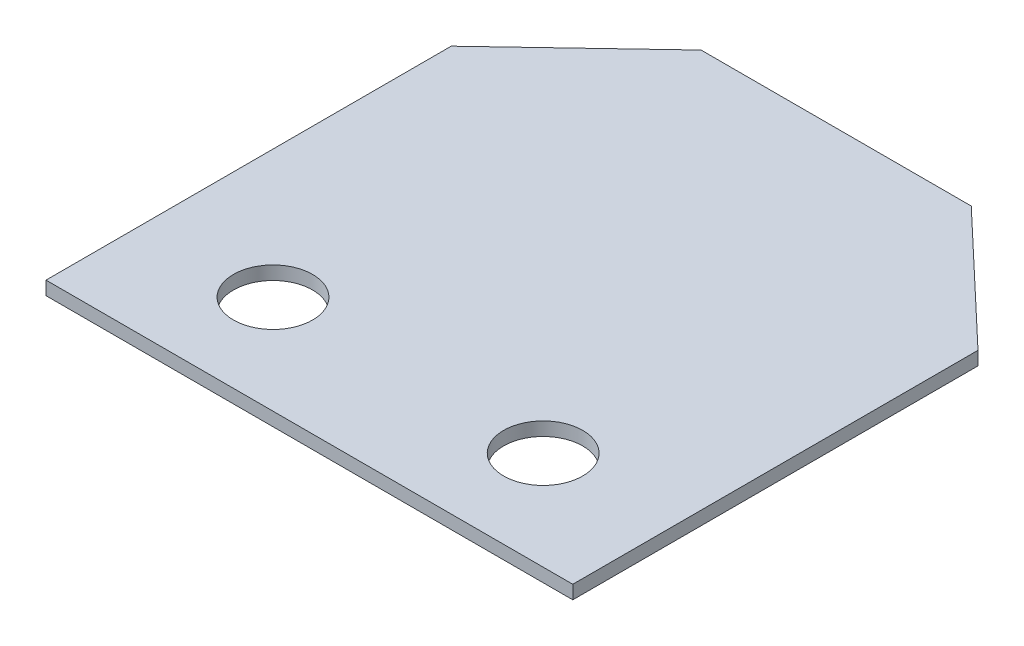
ISO-10303-21;
HEADER;
FILE_DESCRIPTION(('STEP AP214'),'2;1');
FILE_NAME('part.step','',(''),(''),'','','');
FILE_SCHEMA(('AUTOMOTIVE_DESIGN { 1 0 10303 214 1 1 1 1 }'));
ENDSEC;
DATA;
#1=APPLICATION_CONTEXT('core data for automotive mechanical design processes');
#2=APPLICATION_PROTOCOL_DEFINITION('international standard','automotive_design',2000,#1);
#3=PRODUCT_CONTEXT('',#1,'mechanical');
#4=PRODUCT('Part','Part','',(#3));
#5=PRODUCT_RELATED_PRODUCT_CATEGORY('part','',(#4));
#6=PRODUCT_DEFINITION_FORMATION('','',#4);
#7=PRODUCT_DEFINITION_CONTEXT('part definition',#1,'design');
#8=PRODUCT_DEFINITION('design','',#6,#7);
#9=PRODUCT_DEFINITION_SHAPE('','',#8);
#10=(LENGTH_UNIT() NAMED_UNIT(*) SI_UNIT(.MILLI.,.METRE.));
#11=(NAMED_UNIT(*) PLANE_ANGLE_UNIT() SI_UNIT($,.RADIAN.));
#12=(NAMED_UNIT(*) SI_UNIT($,.STERADIAN.) SOLID_ANGLE_UNIT());
#13=UNCERTAINTY_MEASURE_WITH_UNIT(LENGTH_MEASURE(1.E-05),#10,'distance_accuracy_value','');
#14=(GEOMETRIC_REPRESENTATION_CONTEXT(3) GLOBAL_UNCERTAINTY_ASSIGNED_CONTEXT((#13)) GLOBAL_UNIT_ASSIGNED_CONTEXT((#10,
#11,#12)) REPRESENTATION_CONTEXT('',''));
#15=CARTESIAN_POINT('',(0.,0.,0.));
#16=DIRECTION('',(0.,0.,1.));
#17=DIRECTION('',(1.,0.,0.));
#18=AXIS2_PLACEMENT_3D('',#15,#16,#17);
#19=CARTESIAN_POINT('',(0.,2.,0.));
#20=DIRECTION('',(0.,-1.,0.));
#21=DIRECTION('',(0.,0.,-1.));
#22=AXIS2_PLACEMENT_3D('',#19,#20,#21);
#23=PLANE('',#22);
#24=DIRECTION('',(-0.725952683905827,0.,-0.687744647910783));
#25=VECTOR('',#24,1.);
#26=CARTESIAN_POINT('',(20.,2.,-48.));
#27=LINE('',#26,#25);
#28=CARTESIAN_POINT('',(39.,2.,-30.));
#29=VERTEX_POINT('',#28);
#30=CARTESIAN_POINT('',(20.,2.,-48.));
#31=VERTEX_POINT('',#30);
#32=EDGE_CURVE('E146',#29,#31,#27,.T.);
#33=ORIENTED_EDGE('',*,*,#32,.T.);
#34=DIRECTION('',(-1.,0.,0.));
#35=VECTOR('',#34,1.);
#36=CARTESIAN_POINT('',(-20.,2.,-48.));
#37=LINE('',#36,#35);
#38=CARTESIAN_POINT('',(-20.,2.,-48.));
#39=VERTEX_POINT('',#38);
#40=EDGE_CURVE('E94',#31,#39,#37,.T.);
#41=ORIENTED_EDGE('',*,*,#40,.T.);
#42=DIRECTION('',(-0.725952683905827,0.,0.687744647910783));
#43=VECTOR('',#42,1.);
#44=CARTESIAN_POINT('',(-20.,2.,-48.));
#45=LINE('',#44,#43);
#46=CARTESIAN_POINT('',(-39.,2.,-30.));
#47=VERTEX_POINT('',#46);
#48=EDGE_CURVE('E107',#39,#47,#45,.T.);
#49=ORIENTED_EDGE('',*,*,#48,.T.);
#50=DIRECTION('',(0.,0.,1.));
#51=VECTOR('',#50,1.);
#52=CARTESIAN_POINT('',(-39.,2.,30.));
#53=LINE('',#52,#51);
#54=CARTESIAN_POINT('',(-39.,2.,30.));
#55=VERTEX_POINT('',#54);
#56=EDGE_CURVE('E101',#47,#55,#53,.T.);
#57=ORIENTED_EDGE('',*,*,#56,.T.);
#58=DIRECTION('',(1.,0.,0.));
#59=VECTOR('',#58,1.);
#60=CARTESIAN_POINT('',(-39.,2.,30.));
#61=LINE('',#60,#59);
#62=CARTESIAN_POINT('',(39.,2.,30.));
#63=VERTEX_POINT('',#62);
#64=EDGE_CURVE('E105',#55,#63,#61,.T.);
#65=ORIENTED_EDGE('',*,*,#64,.T.);
#66=DIRECTION('',(0.,0.,-1.));
#67=VECTOR('',#66,1.);
#68=CARTESIAN_POINT('',(39.,2.,30.));
#69=LINE('',#68,#67);
#70=EDGE_CURVE('E57',#63,#29,#69,.T.);
#71=ORIENTED_EDGE('',*,*,#70,.T.);
#72=EDGE_LOOP('',(#33,#41,#49,#57,#65,#71));
#73=FACE_BOUND('',#72,.T.);
#74=CARTESIAN_POINT('',(-20.,2.,15.3846153846154));
#75=DIRECTION('',(0.,1.,0.));
#76=DIRECTION('',(0.,0.,1.));
#77=AXIS2_PLACEMENT_3D('',#74,#75,#76);
#78=CIRCLE('',#77,5.85702381253961);
#79=CARTESIAN_POINT('',(-20.,2.,21.241639197155));
#80=VERTEX_POINT('',#79);
#81=EDGE_CURVE('E134',#80,#80,#78,.T.);
#82=ORIENTED_EDGE('',*,*,#81,.F.);
#83=EDGE_LOOP('',(#82));
#84=FACE_BOUND('',#83,.T.);
#85=CARTESIAN_POINT('',(20.,2.,15.3846153846154));
#86=DIRECTION('',(0.,1.,0.));
#87=DIRECTION('',(0.,0.,-1.));
#88=AXIS2_PLACEMENT_3D('',#85,#86,#87);
#89=CIRCLE('',#88,5.85702381253961);
#90=CARTESIAN_POINT('',(20.,2.,9.52759157207579));
#91=VERTEX_POINT('',#90);
#92=EDGE_CURVE('E191',#91,#91,#89,.T.);
#93=ORIENTED_EDGE('',*,*,#92,.F.);
#94=EDGE_LOOP('',(#93));
#95=FACE_BOUND('',#94,.T.);
#96=ADVANCED_FACE('F39',(#73,#84,#95),#23,.F.);
#97=CARTESIAN_POINT('',(0.,0.,0.));
#98=DIRECTION('',(0.,-1.,0.));
#99=DIRECTION('',(0.,0.,-1.));
#100=AXIS2_PLACEMENT_3D('',#97,#98,#99);
#101=PLANE('',#100);
#102=CARTESIAN_POINT('',(-20.,0.,15.3846153846154));
#103=DIRECTION('',(0.,1.,0.));
#104=DIRECTION('',(0.,0.,1.));
#105=AXIS2_PLACEMENT_3D('',#102,#103,#104);
#106=CIRCLE('',#105,5.85702381253961);
#107=CARTESIAN_POINT('',(-20.,0.,21.241639197155));
#108=VERTEX_POINT('',#107);
#109=EDGE_CURVE('E198',#108,#108,#106,.T.);
#110=ORIENTED_EDGE('',*,*,#109,.T.);
#111=EDGE_LOOP('',(#110));
#112=FACE_BOUND('',#111,.T.);
#113=DIRECTION('',(-0.725952683905827,0.,-0.687744647910783));
#114=VECTOR('',#113,1.);
#115=CARTESIAN_POINT('',(20.,0.,-48.));
#116=LINE('',#115,#114);
#117=CARTESIAN_POINT('',(39.,0.,-30.));
#118=VERTEX_POINT('',#117);
#119=CARTESIAN_POINT('',(20.,0.,-48.));
#120=VERTEX_POINT('',#119);
#121=EDGE_CURVE('E129',#118,#120,#116,.T.);
#122=ORIENTED_EDGE('',*,*,#121,.F.);
#123=DIRECTION('',(0.,0.,-1.));
#124=VECTOR('',#123,1.);
#125=CARTESIAN_POINT('',(39.,0.,30.));
#126=LINE('',#125,#124);
#127=CARTESIAN_POINT('',(39.,0.,30.));
#128=VERTEX_POINT('',#127);
#129=EDGE_CURVE('E86',#128,#118,#126,.T.);
#130=ORIENTED_EDGE('',*,*,#129,.F.);
#131=DIRECTION('',(1.,0.,0.));
#132=VECTOR('',#131,1.);
#133=CARTESIAN_POINT('',(-39.,0.,30.));
#134=LINE('',#133,#132);
#135=CARTESIAN_POINT('',(-39.,0.,30.));
#136=VERTEX_POINT('',#135);
#137=EDGE_CURVE('E80',#136,#128,#134,.T.);
#138=ORIENTED_EDGE('',*,*,#137,.F.);
#139=DIRECTION('',(0.,0.,1.));
#140=VECTOR('',#139,1.);
#141=CARTESIAN_POINT('',(-39.,0.,30.));
#142=LINE('',#141,#140);
#143=CARTESIAN_POINT('',(-39.,0.,-30.));
#144=VERTEX_POINT('',#143);
#145=EDGE_CURVE('E116',#144,#136,#142,.T.);
#146=ORIENTED_EDGE('',*,*,#145,.F.);
#147=DIRECTION('',(-0.725952683905827,0.,0.687744647910783));
#148=VECTOR('',#147,1.);
#149=CARTESIAN_POINT('',(-20.,0.,-48.));
#150=LINE('',#149,#148);
#151=CARTESIAN_POINT('',(-20.,0.,-48.));
#152=VERTEX_POINT('',#151);
#153=EDGE_CURVE('E137',#152,#144,#150,.T.);
#154=ORIENTED_EDGE('',*,*,#153,.F.);
#155=DIRECTION('',(-1.,0.,0.));
#156=VECTOR('',#155,1.);
#157=CARTESIAN_POINT('',(-20.,0.,-48.));
#158=LINE('',#157,#156);
#159=EDGE_CURVE('E133',#120,#152,#158,.T.);
#160=ORIENTED_EDGE('',*,*,#159,.F.);
#161=EDGE_LOOP('',(#122,#130,#138,#146,#154,#160));
#162=FACE_BOUND('',#161,.T.);
#163=CARTESIAN_POINT('',(20.,0.,15.3846153846154));
#164=DIRECTION('',(0.,1.,0.));
#165=DIRECTION('',(0.,0.,-1.));
#166=AXIS2_PLACEMENT_3D('',#163,#164,#165);
#167=CIRCLE('',#166,5.85702381253961);
#168=CARTESIAN_POINT('',(20.,0.,9.52759157207579));
#169=VERTEX_POINT('',#168);
#170=EDGE_CURVE('E194',#169,#169,#167,.T.);
#171=ORIENTED_EDGE('',*,*,#170,.T.);
#172=EDGE_LOOP('',(#171));
#173=FACE_BOUND('',#172,.T.);
#174=ADVANCED_FACE('F159',(#112,#162,#173),#101,.T.);
#175=CARTESIAN_POINT('',(20.,2.,-48.));
#176=DIRECTION('',(-0.687744647910783,0.,0.725952683905827));
#177=DIRECTION('',(0.725952683905827,0.,0.687744647910783));
#178=AXIS2_PLACEMENT_3D('',#175,#176,#177);
#179=PLANE('',#178);
#180=ORIENTED_EDGE('',*,*,#121,.T.);
#181=DIRECTION('',(0.,-1.,0.));
#182=VECTOR('',#181,1.);
#183=CARTESIAN_POINT('',(20.,2.,-48.));
#184=LINE('',#183,#182);
#185=EDGE_CURVE('E11',#31,#120,#184,.T.);
#186=ORIENTED_EDGE('',*,*,#185,.F.);
#187=ORIENTED_EDGE('',*,*,#32,.F.);
#188=DIRECTION('',(0.,-1.,0.));
#189=VECTOR('',#188,1.);
#190=CARTESIAN_POINT('',(39.,2.,-30.));
#191=LINE('',#190,#189);
#192=EDGE_CURVE('E125',#29,#118,#191,.T.);
#193=ORIENTED_EDGE('',*,*,#192,.T.);
#194=EDGE_LOOP('',(#180,#186,#187,#193));
#195=FACE_BOUND('',#194,.T.);
#196=ADVANCED_FACE('F41',(#195),#179,.F.);
#197=CARTESIAN_POINT('',(-20.,2.,-48.));
#198=DIRECTION('',(0.,0.,1.));
#199=DIRECTION('',(1.,0.,0.));
#200=AXIS2_PLACEMENT_3D('',#197,#198,#199);
#201=PLANE('',#200);
#202=ORIENTED_EDGE('',*,*,#159,.T.);
#203=DIRECTION('',(0.,-1.,0.));
#204=VECTOR('',#203,1.);
#205=CARTESIAN_POINT('',(-20.,2.,-48.));
#206=LINE('',#205,#204);
#207=EDGE_CURVE('E49',#39,#152,#206,.T.);
#208=ORIENTED_EDGE('',*,*,#207,.F.);
#209=ORIENTED_EDGE('',*,*,#40,.F.);
#210=ORIENTED_EDGE('',*,*,#185,.T.);
#211=EDGE_LOOP('',(#202,#208,#209,#210));
#212=FACE_BOUND('',#211,.T.);
#213=ADVANCED_FACE('F246',(#212),#201,.F.);
#214=CARTESIAN_POINT('',(-20.,2.,-48.));
#215=DIRECTION('',(0.687744647910783,0.,0.725952683905827));
#216=DIRECTION('',(0.725952683905827,0.,-0.687744647910783));
#217=AXIS2_PLACEMENT_3D('',#214,#215,#216);
#218=PLANE('',#217);
#219=ORIENTED_EDGE('',*,*,#153,.T.);
#220=DIRECTION('',(0.,-1.,0.));
#221=VECTOR('',#220,1.);
#222=CARTESIAN_POINT('',(-39.,2.,-30.));
#223=LINE('',#222,#221);
#224=EDGE_CURVE('E118',#47,#144,#223,.T.);
#225=ORIENTED_EDGE('',*,*,#224,.F.);
#226=ORIENTED_EDGE('',*,*,#48,.F.);
#227=ORIENTED_EDGE('',*,*,#207,.T.);
#228=EDGE_LOOP('',(#219,#225,#226,#227));
#229=FACE_BOUND('',#228,.T.);
#230=ADVANCED_FACE('F156',(#229),#218,.F.);
#231=CARTESIAN_POINT('',(-39.,2.,30.));
#232=DIRECTION('',(1.,0.,0.));
#233=DIRECTION('',(0.,0.,-1.));
#234=AXIS2_PLACEMENT_3D('',#231,#232,#233);
#235=PLANE('',#234);
#236=ORIENTED_EDGE('',*,*,#145,.T.);
#237=DIRECTION('',(0.,-1.,0.));
#238=VECTOR('',#237,1.);
#239=CARTESIAN_POINT('',(-39.,2.,30.));
#240=LINE('',#239,#238);
#241=EDGE_CURVE('E113',#55,#136,#240,.T.);
#242=ORIENTED_EDGE('',*,*,#241,.F.);
#243=ORIENTED_EDGE('',*,*,#56,.F.);
#244=ORIENTED_EDGE('',*,*,#224,.T.);
#245=EDGE_LOOP('',(#236,#242,#243,#244));
#246=FACE_BOUND('',#245,.T.);
#247=ADVANCED_FACE('F114',(#246),#235,.F.);
#248=CARTESIAN_POINT('',(-39.,2.,30.));
#249=DIRECTION('',(0.,0.,-1.));
#250=DIRECTION('',(-1.,0.,0.));
#251=AXIS2_PLACEMENT_3D('',#248,#249,#250);
#252=PLANE('',#251);
#253=ORIENTED_EDGE('',*,*,#137,.T.);
#254=DIRECTION('',(0.,-1.,0.));
#255=VECTOR('',#254,1.);
#256=CARTESIAN_POINT('',(39.,2.,30.));
#257=LINE('',#256,#255);
#258=EDGE_CURVE('E119',#63,#128,#257,.T.);
#259=ORIENTED_EDGE('',*,*,#258,.F.);
#260=ORIENTED_EDGE('',*,*,#64,.F.);
#261=ORIENTED_EDGE('',*,*,#241,.T.);
#262=EDGE_LOOP('',(#253,#259,#260,#261));
#263=FACE_BOUND('',#262,.T.);
#264=ADVANCED_FACE('F121',(#263),#252,.F.);
#265=CARTESIAN_POINT('',(39.,2.,30.));
#266=DIRECTION('',(-1.,0.,0.));
#267=DIRECTION('',(0.,0.,1.));
#268=AXIS2_PLACEMENT_3D('',#265,#266,#267);
#269=PLANE('',#268);
#270=ORIENTED_EDGE('',*,*,#129,.T.);
#271=ORIENTED_EDGE('',*,*,#192,.F.);
#272=ORIENTED_EDGE('',*,*,#70,.F.);
#273=ORIENTED_EDGE('',*,*,#258,.T.);
#274=EDGE_LOOP('',(#270,#271,#272,#273));
#275=FACE_BOUND('',#274,.T.);
#276=ADVANCED_FACE('F164',(#275),#269,.F.);
#277=CARTESIAN_POINT('',(-20.,2.,15.3846153846154));
#278=DIRECTION('',(0.,-1.,0.));
#279=DIRECTION('',(0.,0.,-1.));
#280=AXIS2_PLACEMENT_3D('',#277,#278,#279);
#281=CYLINDRICAL_SURFACE('',#280,5.85702381253961);
#282=ORIENTED_EDGE('',*,*,#81,.T.);
#283=EDGE_LOOP('',(#282));
#284=FACE_BOUND('',#283,.T.);
#285=ORIENTED_EDGE('',*,*,#109,.F.);
#286=EDGE_LOOP('',(#285));
#287=FACE_BOUND('',#286,.T.);
#288=ADVANCED_FACE('F166',(#284,#287),#281,.F.);
#289=CARTESIAN_POINT('',(20.,2.,15.3846153846154));
#290=DIRECTION('',(0.,-1.,0.));
#291=DIRECTION('',(0.,0.,-1.));
#292=AXIS2_PLACEMENT_3D('',#289,#290,#291);
#293=CYLINDRICAL_SURFACE('',#292,5.85702381253961);
#294=ORIENTED_EDGE('',*,*,#92,.T.);
#295=EDGE_LOOP('',(#294));
#296=FACE_BOUND('',#295,.T.);
#297=ORIENTED_EDGE('',*,*,#170,.F.);
#298=EDGE_LOOP('',(#297));
#299=FACE_BOUND('',#298,.T.);
#300=ADVANCED_FACE('F172',(#296,#299),#293,.F.);
#301=CLOSED_SHELL('',(#96,#174,#196,#213,#230,#247,#264,#276,#288,#300));
#302=MANIFOLD_SOLID_BREP('B2',#301);
#303=ADVANCED_BREP_SHAPE_REPRESENTATION('',(#18,#302),#14);
#304=SHAPE_DEFINITION_REPRESENTATION(#9,#303);
ENDSEC;
END-ISO-10303-21;
